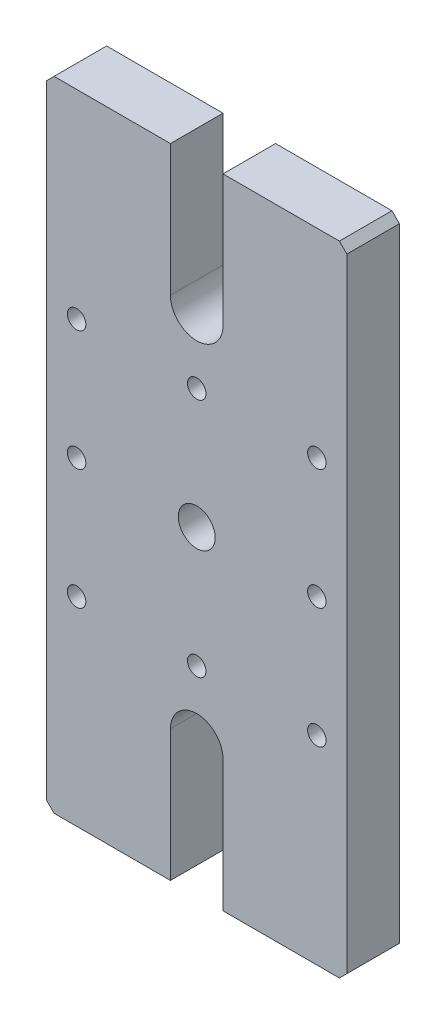
ISO-10303-21;
HEADER;
FILE_DESCRIPTION(('STEP AP214'),'2;1');
FILE_NAME('part.step','',(''),(''),'','','');
FILE_SCHEMA(('AUTOMOTIVE_DESIGN { 1 0 10303 214 1 1 1 1 }'));
ENDSEC;
DATA;
#1=APPLICATION_CONTEXT('core data for automotive mechanical design processes');
#2=APPLICATION_PROTOCOL_DEFINITION('international standard','automotive_design',2000,#1);
#3=PRODUCT_CONTEXT('',#1,'mechanical');
#4=PRODUCT('Part','Part','',(#3));
#5=PRODUCT_RELATED_PRODUCT_CATEGORY('part','',(#4));
#6=PRODUCT_DEFINITION_FORMATION('','',#4);
#7=PRODUCT_DEFINITION_CONTEXT('part definition',#1,'design');
#8=PRODUCT_DEFINITION('design','',#6,#7);
#9=PRODUCT_DEFINITION_SHAPE('','',#8);
#10=(LENGTH_UNIT() NAMED_UNIT(*) SI_UNIT(.MILLI.,.METRE.));
#11=(NAMED_UNIT(*) PLANE_ANGLE_UNIT() SI_UNIT($,.RADIAN.));
#12=(NAMED_UNIT(*) SI_UNIT($,.STERADIAN.) SOLID_ANGLE_UNIT());
#13=UNCERTAINTY_MEASURE_WITH_UNIT(LENGTH_MEASURE(1.E-05),#10,'distance_accuracy_value','');
#14=(GEOMETRIC_REPRESENTATION_CONTEXT(3) GLOBAL_UNCERTAINTY_ASSIGNED_CONTEXT((#13)) GLOBAL_UNIT_ASSIGNED_CONTEXT((#10,
#11,#12)) REPRESENTATION_CONTEXT('',''));
#15=CARTESIAN_POINT('',(0.,0.,0.));
#16=DIRECTION('',(0.,0.,1.));
#17=DIRECTION('',(1.,0.,0.));
#18=AXIS2_PLACEMENT_3D('',#15,#16,#17);
#19=CARTESIAN_POINT('',(-20.,42.5,0.));
#20=DIRECTION('',(0.,1.,0.));
#21=DIRECTION('',(1.,0.,0.));
#22=AXIS2_PLACEMENT_3D('',#19,#20,#21);
#23=PLANE('',#22);
#24=DIRECTION('',(0.,0.,1.));
#25=VECTOR('',#24,1.);
#26=CARTESIAN_POINT('',(19.,42.5,0.));
#27=LINE('',#26,#25);
#28=CARTESIAN_POINT('',(19.,42.5,0.));
#29=VERTEX_POINT('',#28);
#30=CARTESIAN_POINT('',(19.,42.5,7.));
#31=VERTEX_POINT('',#30);
#32=EDGE_CURVE('E351',#29,#31,#27,.T.);
#33=ORIENTED_EDGE('',*,*,#32,.F.);
#34=DIRECTION('',(1.,0.,0.));
#35=VECTOR('',#34,1.);
#36=CARTESIAN_POINT('',(3.5,42.5,0.));
#37=LINE('',#36,#35);
#38=CARTESIAN_POINT('',(3.5,42.5,0.));
#39=VERTEX_POINT('',#38);
#40=EDGE_CURVE('E297',#39,#29,#37,.T.);
#41=ORIENTED_EDGE('',*,*,#40,.F.);
#42=DIRECTION('',(0.,0.,1.));
#43=VECTOR('',#42,1.);
#44=CARTESIAN_POINT('',(3.5,42.5,0.));
#45=LINE('',#44,#43);
#46=CARTESIAN_POINT('',(3.5,42.5,7.));
#47=VERTEX_POINT('',#46);
#48=EDGE_CURVE('E210',#39,#47,#45,.T.);
#49=ORIENTED_EDGE('',*,*,#48,.T.);
#50=DIRECTION('',(1.,0.,0.));
#51=VECTOR('',#50,1.);
#52=CARTESIAN_POINT('',(3.5,42.5,7.));
#53=LINE('',#52,#51);
#54=EDGE_CURVE('E10',#47,#31,#53,.T.);
#55=ORIENTED_EDGE('',*,*,#54,.T.);
#56=EDGE_LOOP('',(#33,#41,#49,#55));
#57=FACE_BOUND('',#56,.T.);
#58=ADVANCED_FACE('F15',(#57),#23,.T.);
#59=CARTESIAN_POINT('',(0.,0.,7.));
#60=DIRECTION('',(0.,0.,1.));
#61=DIRECTION('',(1.,0.,0.));
#62=AXIS2_PLACEMENT_3D('',#59,#60,#61);
#63=PLANE('',#62);
#64=CARTESIAN_POINT('',(0.,0.,7.));
#65=DIRECTION('',(0.,0.,-1.));
#66=DIRECTION('',(1.,0.,0.));
#67=AXIS2_PLACEMENT_3D('',#64,#65,#66);
#68=CIRCLE('',#67,2.4585);
#69=CARTESIAN_POINT('',(2.4585,0.,7.));
#70=VERTEX_POINT('',#69);
#71=EDGE_CURVE('E258',#70,#70,#68,.T.);
#72=ORIENTED_EDGE('',*,*,#71,.T.);
#73=EDGE_LOOP('',(#72));
#74=FACE_BOUND('',#73,.T.);
#75=CARTESIAN_POINT('',(16.,16.,7.));
#76=DIRECTION('',(0.,0.,-1.));
#77=DIRECTION('',(1.,0.,0.));
#78=AXIS2_PLACEMENT_3D('',#75,#76,#77);
#79=CIRCLE('',#78,1.2295);
#80=CARTESIAN_POINT('',(17.2295,16.,7.));
#81=VERTEX_POINT('',#80);
#82=EDGE_CURVE('E255',#81,#81,#79,.T.);
#83=ORIENTED_EDGE('',*,*,#82,.T.);
#84=EDGE_LOOP('',(#83));
#85=FACE_BOUND('',#84,.T.);
#86=CARTESIAN_POINT('',(0.,16.,7.));
#87=DIRECTION('',(0.,0.,-1.));
#88=DIRECTION('',(1.,0.,0.));
#89=AXIS2_PLACEMENT_3D('',#86,#87,#88);
#90=CIRCLE('',#89,1.2295);
#91=CARTESIAN_POINT('',(1.2295,16.,7.));
#92=VERTEX_POINT('',#91);
#93=EDGE_CURVE('E251',#92,#92,#90,.T.);
#94=ORIENTED_EDGE('',*,*,#93,.T.);
#95=EDGE_LOOP('',(#94));
#96=FACE_BOUND('',#95,.T.);
#97=CARTESIAN_POINT('',(-16.,16.,7.));
#98=DIRECTION('',(0.,0.,-1.));
#99=DIRECTION('',(1.,0.,0.));
#100=AXIS2_PLACEMENT_3D('',#97,#98,#99);
#101=CIRCLE('',#100,1.2295);
#102=CARTESIAN_POINT('',(-14.7705,16.,7.));
#103=VERTEX_POINT('',#102);
#104=EDGE_CURVE('E243',#103,#103,#101,.T.);
#105=ORIENTED_EDGE('',*,*,#104,.T.);
#106=EDGE_LOOP('',(#105));
#107=FACE_BOUND('',#106,.T.);
#108=CARTESIAN_POINT('',(16.,0.,7.));
#109=DIRECTION('',(0.,0.,-1.));
#110=DIRECTION('',(1.,0.,0.));
#111=AXIS2_PLACEMENT_3D('',#108,#109,#110);
#112=CIRCLE('',#111,1.2295);
#113=CARTESIAN_POINT('',(17.2295,0.,7.));
#114=VERTEX_POINT('',#113);
#115=EDGE_CURVE('E315',#114,#114,#112,.T.);
#116=ORIENTED_EDGE('',*,*,#115,.T.);
#117=EDGE_LOOP('',(#116));
#118=FACE_BOUND('',#117,.T.);
#119=CARTESIAN_POINT('',(-16.,0.,7.));
#120=DIRECTION('',(0.,0.,-1.));
#121=DIRECTION('',(1.,0.,0.));
#122=AXIS2_PLACEMENT_3D('',#119,#120,#121);
#123=CIRCLE('',#122,1.2295);
#124=CARTESIAN_POINT('',(-14.7705,0.,7.));
#125=VERTEX_POINT('',#124);
#126=EDGE_CURVE('E313',#125,#125,#123,.T.);
#127=ORIENTED_EDGE('',*,*,#126,.T.);
#128=EDGE_LOOP('',(#127));
#129=FACE_BOUND('',#128,.T.);
#130=CARTESIAN_POINT('',(16.,-16.,7.));
#131=DIRECTION('',(0.,0.,-1.));
#132=DIRECTION('',(1.,0.,0.));
#133=AXIS2_PLACEMENT_3D('',#130,#131,#132);
#134=CIRCLE('',#133,1.2295);
#135=CARTESIAN_POINT('',(17.2295,-16.,7.));
#136=VERTEX_POINT('',#135);
#137=EDGE_CURVE('E316',#136,#136,#134,.T.);
#138=ORIENTED_EDGE('',*,*,#137,.T.);
#139=EDGE_LOOP('',(#138));
#140=FACE_BOUND('',#139,.T.);
#141=CARTESIAN_POINT('',(0.,-16.,7.));
#142=DIRECTION('',(0.,0.,-1.));
#143=DIRECTION('',(1.,0.,0.));
#144=AXIS2_PLACEMENT_3D('',#141,#142,#143);
#145=CIRCLE('',#144,1.2295);
#146=CARTESIAN_POINT('',(1.2295,-16.,7.));
#147=VERTEX_POINT('',#146);
#148=EDGE_CURVE('E376',#147,#147,#145,.T.);
#149=ORIENTED_EDGE('',*,*,#148,.T.);
#150=EDGE_LOOP('',(#149));
#151=FACE_BOUND('',#150,.T.);
#152=CARTESIAN_POINT('',(-16.,-16.,7.));
#153=DIRECTION('',(0.,0.,-1.));
#154=DIRECTION('',(1.,0.,0.));
#155=AXIS2_PLACEMENT_3D('',#152,#153,#154);
#156=CIRCLE('',#155,1.2295);
#157=CARTESIAN_POINT('',(-14.7705,-16.,7.));
#158=VERTEX_POINT('',#157);
#159=EDGE_CURVE('E419',#158,#158,#156,.T.);
#160=ORIENTED_EDGE('',*,*,#159,.T.);
#161=EDGE_LOOP('',(#160));
#162=FACE_BOUND('',#161,.T.);
#163=DIRECTION('',(-0.707106781186548,0.707106781186548,0.));
#164=VECTOR('',#163,1.);
#165=CARTESIAN_POINT('',(-19.,-42.5,7.));
#166=LINE('',#165,#164);
#167=CARTESIAN_POINT('',(-19.,-42.5,7.));
#168=VERTEX_POINT('',#167);
#169=CARTESIAN_POINT('',(-20.,-41.5,7.));
#170=VERTEX_POINT('',#169);
#171=EDGE_CURVE('E448',#168,#170,#166,.T.);
#172=ORIENTED_EDGE('',*,*,#171,.F.);
#173=DIRECTION('',(-1.,0.,0.));
#174=VECTOR('',#173,1.);
#175=CARTESIAN_POINT('',(-3.5,-42.5,7.));
#176=LINE('',#175,#174);
#177=CARTESIAN_POINT('',(-3.5,-42.5,7.));
#178=VERTEX_POINT('',#177);
#179=EDGE_CURVE('E23',#178,#168,#176,.T.);
#180=ORIENTED_EDGE('',*,*,#179,.F.);
#181=DIRECTION('',(0.,1.,0.));
#182=VECTOR('',#181,1.);
#183=CARTESIAN_POINT('',(-3.5,-42.5,7.));
#184=LINE('',#183,#182);
#185=CARTESIAN_POINT('',(-3.5,-25.,7.));
#186=VERTEX_POINT('',#185);
#187=EDGE_CURVE('E196',#178,#186,#184,.T.);
#188=ORIENTED_EDGE('',*,*,#187,.T.);
#189=CARTESIAN_POINT('',(0.,-25.,7.));
#190=DIRECTION('',(0.,0.,-1.));
#191=DIRECTION('',(0.999999999999981,1.93201454E-07,0.));
#192=AXIS2_PLACEMENT_3D('',#189,#190,#191);
#193=CIRCLE('',#192,3.5);
#194=CARTESIAN_POINT('',(3.5,-24.9999993237949,7.));
#195=VERTEX_POINT('',#194);
#196=EDGE_CURVE('E183',#186,#195,#193,.T.);
#197=ORIENTED_EDGE('',*,*,#196,.T.);
#198=DIRECTION('',(0.,-1.,0.));
#199=VECTOR('',#198,1.);
#200=CARTESIAN_POINT('',(3.5,-24.9999993237949,7.));
#201=LINE('',#200,#199);
#202=CARTESIAN_POINT('',(3.5,-42.5,7.));
#203=VERTEX_POINT('',#202);
#204=EDGE_CURVE('E47',#195,#203,#201,.T.);
#205=ORIENTED_EDGE('',*,*,#204,.T.);
#206=DIRECTION('',(-1.,0.,0.));
#207=VECTOR('',#206,1.);
#208=CARTESIAN_POINT('',(19.,-42.5,7.));
#209=LINE('',#208,#207);
#210=CARTESIAN_POINT('',(19.,-42.5,7.));
#211=VERTEX_POINT('',#210);
#212=EDGE_CURVE('E35',#211,#203,#209,.T.);
#213=ORIENTED_EDGE('',*,*,#212,.F.);
#214=DIRECTION('',(-0.707106781186548,-0.707106781186548,0.));
#215=VECTOR('',#214,1.);
#216=CARTESIAN_POINT('',(20.,-41.5,7.));
#217=LINE('',#216,#215);
#218=CARTESIAN_POINT('',(20.,-41.5,7.));
#219=VERTEX_POINT('',#218);
#220=EDGE_CURVE('E341',#219,#211,#217,.T.);
#221=ORIENTED_EDGE('',*,*,#220,.F.);
#222=DIRECTION('',(0.,-1.,0.));
#223=VECTOR('',#222,1.);
#224=CARTESIAN_POINT('',(20.,41.5,7.));
#225=LINE('',#224,#223);
#226=CARTESIAN_POINT('',(20.,41.5,7.));
#227=VERTEX_POINT('',#226);
#228=EDGE_CURVE('E409',#227,#219,#225,.T.);
#229=ORIENTED_EDGE('',*,*,#228,.F.);
#230=DIRECTION('',(0.707106781186548,-0.707106781186548,0.));
#231=VECTOR('',#230,1.);
#232=CARTESIAN_POINT('',(19.,42.5,7.));
#233=LINE('',#232,#231);
#234=EDGE_CURVE('E352',#31,#227,#233,.T.);
#235=ORIENTED_EDGE('',*,*,#234,.F.);
#236=ORIENTED_EDGE('',*,*,#54,.F.);
#237=DIRECTION('',(0.,-1.,0.));
#238=VECTOR('',#237,1.);
#239=CARTESIAN_POINT('',(3.5,42.5,7.));
#240=LINE('',#239,#238);
#241=CARTESIAN_POINT('',(3.5,25.,7.));
#242=VERTEX_POINT('',#241);
#243=EDGE_CURVE('E217',#47,#242,#240,.T.);
#244=ORIENTED_EDGE('',*,*,#243,.T.);
#245=CARTESIAN_POINT('',(0.,25.,7.));
#246=DIRECTION('',(0.,0.,-1.));
#247=DIRECTION('',(-1.,0.,0.));
#248=AXIS2_PLACEMENT_3D('',#245,#246,#247);
#249=CIRCLE('',#248,3.5);
#250=CARTESIAN_POINT('',(-3.5,25.,7.));
#251=VERTEX_POINT('',#250);
#252=EDGE_CURVE('E270',#242,#251,#249,.T.);
#253=ORIENTED_EDGE('',*,*,#252,.T.);
#254=DIRECTION('',(0.,1.,0.));
#255=VECTOR('',#254,1.);
#256=CARTESIAN_POINT('',(-3.5,25.,7.));
#257=LINE('',#256,#255);
#258=CARTESIAN_POINT('',(-3.5,42.5,7.));
#259=VERTEX_POINT('',#258);
#260=EDGE_CURVE('E245',#251,#259,#257,.T.);
#261=ORIENTED_EDGE('',*,*,#260,.T.);
#262=DIRECTION('',(1.,0.,0.));
#263=VECTOR('',#262,1.);
#264=CARTESIAN_POINT('',(-19.,42.5,7.));
#265=LINE('',#264,#263);
#266=CARTESIAN_POINT('',(-19.,42.5,7.));
#267=VERTEX_POINT('',#266);
#268=EDGE_CURVE('E227',#267,#259,#265,.T.);
#269=ORIENTED_EDGE('',*,*,#268,.F.);
#270=DIRECTION('',(0.707106781186548,0.707106781186548,0.));
#271=VECTOR('',#270,1.);
#272=CARTESIAN_POINT('',(-20.,41.5,7.));
#273=LINE('',#272,#271);
#274=CARTESIAN_POINT('',(-20.,41.5,7.));
#275=VERTEX_POINT('',#274);
#276=EDGE_CURVE('E369',#275,#267,#273,.T.);
#277=ORIENTED_EDGE('',*,*,#276,.F.);
#278=DIRECTION('',(0.,1.,0.));
#279=VECTOR('',#278,1.);
#280=CARTESIAN_POINT('',(-20.,-41.5,7.));
#281=LINE('',#280,#279);
#282=EDGE_CURVE('E321',#170,#275,#281,.T.);
#283=ORIENTED_EDGE('',*,*,#282,.F.);
#284=EDGE_LOOP('',(#172,#180,#188,#197,#205,#213,#221,#229,#235,#236,#244,#253,#261,#269,#277,#283));
#285=FACE_BOUND('',#284,.T.);
#286=ADVANCED_FACE('F198',(#74,#85,#96,#107,#118,#129,#140,#151,#162,#285),#63,.T.);
#287=CARTESIAN_POINT('',(20.,-42.5,0.));
#288=DIRECTION('',(0.,-1.,0.));
#289=DIRECTION('',(0.,0.,-1.));
#290=AXIS2_PLACEMENT_3D('',#287,#288,#289);
#291=PLANE('',#290);
#292=DIRECTION('',(0.,0.,1.));
#293=VECTOR('',#292,1.);
#294=CARTESIAN_POINT('',(-19.,-42.5,0.));
#295=LINE('',#294,#293);
#296=CARTESIAN_POINT('',(-19.,-42.5,0.));
#297=VERTEX_POINT('',#296);
#298=EDGE_CURVE('E458',#297,#168,#295,.T.);
#299=ORIENTED_EDGE('',*,*,#298,.F.);
#300=DIRECTION('',(-1.,0.,0.));
#301=VECTOR('',#300,1.);
#302=CARTESIAN_POINT('',(-3.5,-42.5,0.));
#303=LINE('',#302,#301);
#304=CARTESIAN_POINT('',(-3.5,-42.5,0.));
#305=VERTEX_POINT('',#304);
#306=EDGE_CURVE('E360',#305,#297,#303,.T.);
#307=ORIENTED_EDGE('',*,*,#306,.F.);
#308=DIRECTION('',(0.,0.,1.));
#309=VECTOR('',#308,1.);
#310=CARTESIAN_POINT('',(-3.5,-42.5,0.));
#311=LINE('',#310,#309);
#312=EDGE_CURVE('E203',#305,#178,#311,.T.);
#313=ORIENTED_EDGE('',*,*,#312,.T.);
#314=ORIENTED_EDGE('',*,*,#179,.T.);
#315=EDGE_LOOP('',(#299,#307,#313,#314));
#316=FACE_BOUND('',#315,.T.);
#317=ADVANCED_FACE('F546',(#316),#291,.T.);
#318=CARTESIAN_POINT('',(20.,-42.5,0.));
#319=DIRECTION('',(0.,-1.,0.));
#320=DIRECTION('',(0.,0.,-1.));
#321=AXIS2_PLACEMENT_3D('',#318,#319,#320);
#322=PLANE('',#321);
#323=DIRECTION('',(0.,0.,-1.));
#324=VECTOR('',#323,1.);
#325=CARTESIAN_POINT('',(19.,-42.5,7.));
#326=LINE('',#325,#324);
#327=CARTESIAN_POINT('',(19.,-42.5,0.));
#328=VERTEX_POINT('',#327);
#329=EDGE_CURVE('E345',#211,#328,#326,.T.);
#330=ORIENTED_EDGE('',*,*,#329,.F.);
#331=ORIENTED_EDGE('',*,*,#212,.T.);
#332=DIRECTION('',(0.,0.,-1.));
#333=VECTOR('',#332,1.);
#334=CARTESIAN_POINT('',(3.5,-42.5,7.));
#335=LINE('',#334,#333);
#336=CARTESIAN_POINT('',(3.5,-42.5,0.));
#337=VERTEX_POINT('',#336);
#338=EDGE_CURVE('E193',#203,#337,#335,.T.);
#339=ORIENTED_EDGE('',*,*,#338,.T.);
#340=DIRECTION('',(-1.,0.,0.));
#341=VECTOR('',#340,1.);
#342=CARTESIAN_POINT('',(19.,-42.5,0.));
#343=LINE('',#342,#341);
#344=EDGE_CURVE('E328',#328,#337,#343,.T.);
#345=ORIENTED_EDGE('',*,*,#344,.F.);
#346=EDGE_LOOP('',(#330,#331,#339,#345));
#347=FACE_BOUND('',#346,.T.);
#348=ADVANCED_FACE('F578',(#347),#322,.T.);
#349=CARTESIAN_POINT('',(-20.,42.5,0.));
#350=DIRECTION('',(0.,1.,0.));
#351=DIRECTION('',(1.,0.,0.));
#352=AXIS2_PLACEMENT_3D('',#349,#350,#351);
#353=PLANE('',#352);
#354=DIRECTION('',(0.,0.,-1.));
#355=VECTOR('',#354,1.);
#356=CARTESIAN_POINT('',(-19.,42.5,7.));
#357=LINE('',#356,#355);
#358=CARTESIAN_POINT('',(-19.,42.5,0.));
#359=VERTEX_POINT('',#358);
#360=EDGE_CURVE('E377',#267,#359,#357,.T.);
#361=ORIENTED_EDGE('',*,*,#360,.F.);
#362=ORIENTED_EDGE('',*,*,#268,.T.);
#363=DIRECTION('',(0.,0.,-1.));
#364=VECTOR('',#363,1.);
#365=CARTESIAN_POINT('',(-3.5,42.5,7.));
#366=LINE('',#365,#364);
#367=CARTESIAN_POINT('',(-3.5,42.5,0.));
#368=VERTEX_POINT('',#367);
#369=EDGE_CURVE('E250',#259,#368,#366,.T.);
#370=ORIENTED_EDGE('',*,*,#369,.T.);
#371=DIRECTION('',(1.,0.,0.));
#372=VECTOR('',#371,1.);
#373=CARTESIAN_POINT('',(-19.,42.5,0.));
#374=LINE('',#373,#372);
#375=EDGE_CURVE('E309',#359,#368,#374,.T.);
#376=ORIENTED_EDGE('',*,*,#375,.F.);
#377=EDGE_LOOP('',(#361,#362,#370,#376));
#378=FACE_BOUND('',#377,.T.);
#379=ADVANCED_FACE('F479',(#378),#353,.T.);
#380=CARTESIAN_POINT('',(3.5,-42.5,7.));
#381=DIRECTION('',(1.,0.,0.));
#382=DIRECTION('',(0.,1.,0.));
#383=AXIS2_PLACEMENT_3D('',#380,#381,#382);
#384=PLANE('',#383);
#385=DIRECTION('',(0.,1.,0.));
#386=VECTOR('',#385,1.);
#387=CARTESIAN_POINT('',(3.5,-42.5,0.));
#388=LINE('',#387,#386);
#389=CARTESIAN_POINT('',(3.5,-24.9999993237949,0.));
#390=VERTEX_POINT('',#389);
#391=EDGE_CURVE('E323',#337,#390,#388,.T.);
#392=ORIENTED_EDGE('',*,*,#391,.F.);
#393=ORIENTED_EDGE('',*,*,#338,.F.);
#394=ORIENTED_EDGE('',*,*,#204,.F.);
#395=DIRECTION('',(0.,0.,-1.));
#396=VECTOR('',#395,1.);
#397=CARTESIAN_POINT('',(3.5,-24.9999993237949,7.));
#398=LINE('',#397,#396);
#399=EDGE_CURVE('E190',#195,#390,#398,.T.);
#400=ORIENTED_EDGE('',*,*,#399,.T.);
#401=EDGE_LOOP('',(#392,#393,#394,#400));
#402=FACE_BOUND('',#401,.T.);
#403=ADVANCED_FACE('F576',(#402),#384,.F.);
#404=CARTESIAN_POINT('',(0.,-25.,7.));
#405=DIRECTION('',(0.,0.,-1.));
#406=DIRECTION('',(0.999999999999981,1.93201454E-07,0.));
#407=AXIS2_PLACEMENT_3D('',#404,#405,#406);
#408=CYLINDRICAL_SURFACE('',#407,3.5);
#409=CARTESIAN_POINT('',(0.,-25.,0.));
#410=DIRECTION('',(0.,0.,1.));
#411=DIRECTION('',(0.999999999999981,1.93201454E-07,0.));
#412=AXIS2_PLACEMENT_3D('',#409,#410,#411);
#413=CIRCLE('',#412,3.5);
#414=CARTESIAN_POINT('',(-3.5,-25.,0.));
#415=VERTEX_POINT('',#414);
#416=EDGE_CURVE('E327',#390,#415,#413,.T.);
#417=ORIENTED_EDGE('',*,*,#416,.F.);
#418=ORIENTED_EDGE('',*,*,#399,.F.);
#419=ORIENTED_EDGE('',*,*,#196,.F.);
#420=DIRECTION('',(0.,0.,-1.));
#421=VECTOR('',#420,1.);
#422=CARTESIAN_POINT('',(-3.5,-25.,7.));
#423=LINE('',#422,#421);
#424=EDGE_CURVE('E188',#186,#415,#423,.T.);
#425=ORIENTED_EDGE('',*,*,#424,.T.);
#426=EDGE_LOOP('',(#417,#418,#419,#425));
#427=FACE_BOUND('',#426,.T.);
#428=ADVANCED_FACE('F186',(#427),#408,.F.);
#429=CARTESIAN_POINT('',(-3.5,-25.,7.));
#430=DIRECTION('',(-1.,0.,0.));
#431=DIRECTION('',(0.,0.,1.));
#432=AXIS2_PLACEMENT_3D('',#429,#430,#431);
#433=PLANE('',#432);
#434=DIRECTION('',(0.,-1.,0.));
#435=VECTOR('',#434,1.);
#436=CARTESIAN_POINT('',(-3.5,-25.,0.));
#437=LINE('',#436,#435);
#438=EDGE_CURVE('E207',#415,#305,#437,.T.);
#439=ORIENTED_EDGE('',*,*,#438,.F.);
#440=ORIENTED_EDGE('',*,*,#424,.F.);
#441=ORIENTED_EDGE('',*,*,#187,.F.);
#442=ORIENTED_EDGE('',*,*,#312,.F.);
#443=EDGE_LOOP('',(#439,#440,#441,#442));
#444=FACE_BOUND('',#443,.T.);
#445=ADVANCED_FACE('F205',(#444),#433,.F.);
#446=CARTESIAN_POINT('',(3.5,25.,7.));
#447=DIRECTION('',(1.,0.,0.));
#448=DIRECTION('',(0.,1.,0.));
#449=AXIS2_PLACEMENT_3D('',#446,#447,#448);
#450=PLANE('',#449);
#451=DIRECTION('',(0.,1.,0.));
#452=VECTOR('',#451,1.);
#453=CARTESIAN_POINT('',(3.5,25.,0.));
#454=LINE('',#453,#452);
#455=CARTESIAN_POINT('',(3.5,25.,0.));
#456=VERTEX_POINT('',#455);
#457=EDGE_CURVE('E291',#456,#39,#454,.T.);
#458=ORIENTED_EDGE('',*,*,#457,.F.);
#459=DIRECTION('',(0.,0.,-1.));
#460=VECTOR('',#459,1.);
#461=CARTESIAN_POINT('',(3.5,25.,7.));
#462=LINE('',#461,#460);
#463=EDGE_CURVE('E264',#242,#456,#462,.T.);
#464=ORIENTED_EDGE('',*,*,#463,.F.);
#465=ORIENTED_EDGE('',*,*,#243,.F.);
#466=ORIENTED_EDGE('',*,*,#48,.F.);
#467=EDGE_LOOP('',(#458,#464,#465,#466));
#468=FACE_BOUND('',#467,.T.);
#469=ADVANCED_FACE('F292',(#468),#450,.F.);
#470=CARTESIAN_POINT('',(0.,25.,7.));
#471=DIRECTION('',(0.,0.,-1.));
#472=DIRECTION('',(-1.,0.,0.));
#473=AXIS2_PLACEMENT_3D('',#470,#471,#472);
#474=CYLINDRICAL_SURFACE('',#473,3.5);
#475=CARTESIAN_POINT('',(0.,25.,0.));
#476=DIRECTION('',(0.,0.,1.));
#477=DIRECTION('',(-1.,0.,0.));
#478=AXIS2_PLACEMENT_3D('',#475,#476,#477);
#479=CIRCLE('',#478,3.5);
#480=CARTESIAN_POINT('',(-3.5,25.,0.));
#481=VERTEX_POINT('',#480);
#482=EDGE_CURVE('E284',#481,#456,#479,.T.);
#483=ORIENTED_EDGE('',*,*,#482,.F.);
#484=DIRECTION('',(0.,0.,-1.));
#485=VECTOR('',#484,1.);
#486=CARTESIAN_POINT('',(-3.5,25.,7.));
#487=LINE('',#486,#485);
#488=EDGE_CURVE('E249',#251,#481,#487,.T.);
#489=ORIENTED_EDGE('',*,*,#488,.F.);
#490=ORIENTED_EDGE('',*,*,#252,.F.);
#491=ORIENTED_EDGE('',*,*,#463,.T.);
#492=EDGE_LOOP('',(#483,#489,#490,#491));
#493=FACE_BOUND('',#492,.T.);
#494=ADVANCED_FACE('F281',(#493),#474,.F.);
#495=CARTESIAN_POINT('',(-3.5,42.5,7.));
#496=DIRECTION('',(-1.,0.,0.));
#497=DIRECTION('',(0.,0.,1.));
#498=AXIS2_PLACEMENT_3D('',#495,#496,#497);
#499=PLANE('',#498);
#500=DIRECTION('',(0.,-1.,0.));
#501=VECTOR('',#500,1.);
#502=CARTESIAN_POINT('',(-3.5,42.5,0.));
#503=LINE('',#502,#501);
#504=EDGE_CURVE('E303',#368,#481,#503,.T.);
#505=ORIENTED_EDGE('',*,*,#504,.F.);
#506=ORIENTED_EDGE('',*,*,#369,.F.);
#507=ORIENTED_EDGE('',*,*,#260,.F.);
#508=ORIENTED_EDGE('',*,*,#488,.T.);
#509=EDGE_LOOP('',(#505,#506,#507,#508));
#510=FACE_BOUND('',#509,.T.);
#511=ADVANCED_FACE('F604',(#510),#499,.F.);
#512=CARTESIAN_POINT('',(-2.4585,0.,7.));
#513=CARTESIAN_POINT('',(-2.4585,-2.4585,7.00000000000001));
#514=CARTESIAN_POINT('',(0.,-2.4585,7.));
#515=CARTESIAN_POINT('',(2.4585,-2.4585,7.00000000000001));
#516=CARTESIAN_POINT('',(2.4585,0.,7.));
#517=CARTESIAN_POINT('',(2.4585,2.4585,7.00000000000001));
#518=CARTESIAN_POINT('',(0.,2.4585,7.));
#519=CARTESIAN_POINT('',(-2.4585,2.4585,7.00000000000001));
#520=CARTESIAN_POINT('',(-2.4585,0.,7.));
#521=CARTESIAN_POINT('',(-2.4585,0.,0.));
#522=CARTESIAN_POINT('',(-2.4585,-2.4585,0.));
#523=CARTESIAN_POINT('',(0.,-2.4585,0.));
#524=CARTESIAN_POINT('',(2.4585,-2.4585,0.));
#525=CARTESIAN_POINT('',(2.4585,0.,0.));
#526=CARTESIAN_POINT('',(2.4585,2.4585,0.));
#527=CARTESIAN_POINT('',(0.,2.4585,0.));
#528=CARTESIAN_POINT('',(-2.4585,2.4585,0.));
#529=CARTESIAN_POINT('',(-2.4585,0.,0.));
#530=(BOUNDED_SURFACE() B_SPLINE_SURFACE(1,2,((#512,#513,#514,#515,#516,#517,#518,#519,#520),
(#521,#522,#523,#524,#525,#526,#527,#528,#529)),.UNSPECIFIED.,.F.,.T.,
.F.) B_SPLINE_SURFACE_WITH_KNOTS((2,2),(3,2,2,2,3),(-38.3168235951375,-35.4695590029064),(0.,
3.86180276942525,7.72360553885051,11.5854083082758,15.447211077701),
.UNSPECIFIED.) GEOMETRIC_REPRESENTATION_ITEM() RATIONAL_B_SPLINE_SURFACE(((1.,0.707106781186548,
1.,0.707106781186548,1.,0.707106781186548,1.,0.707106781186548,1.),(1.,0.707106781186548,1.,
0.707106781186548,1.,0.707106781186548,1.,0.707106781186548,1.))) REPRESENTATION_ITEM('') SURFACE());
#531=CARTESIAN_POINT('',(0.,0.,0.));
#532=DIRECTION('',(0.,0.,1.));
#533=DIRECTION('',(1.,0.,0.));
#534=AXIS2_PLACEMENT_3D('',#531,#532,#533);
#535=CIRCLE('',#534,2.4585);
#536=CARTESIAN_POINT('',(-2.4585,0.,0.));
#537=VERTEX_POINT('',#536);
#538=EDGE_CURVE('E318',#537,#537,#535,.T.);
#539=ORIENTED_EDGE('',*,*,#71,.F.);
#540=EDGE_LOOP('',(#539));
#541=FACE_BOUND('',#540,.T.);
#542=ORIENTED_EDGE('',*,*,#538,.F.);
#543=EDGE_LOOP('',(#542));
#544=FACE_BOUND('',#543,.T.);
#545=ADVANCED_FACE('F594',(#541,#544),#530,.F.);
#546=CARTESIAN_POINT('',(14.7705,16.,7.));
#547=CARTESIAN_POINT('',(14.7705,14.7705,7.00000000000002));
#548=CARTESIAN_POINT('',(16.,14.7705,7.));
#549=CARTESIAN_POINT('',(17.2295,14.7705,7.00000000000002));
#550=CARTESIAN_POINT('',(17.2295,16.,7.));
#551=CARTESIAN_POINT('',(17.2295,17.2295,7.00000000000002));
#552=CARTESIAN_POINT('',(16.,17.2295,7.));
#553=CARTESIAN_POINT('',(14.7705,17.2295,7.00000000000002));
#554=CARTESIAN_POINT('',(14.7705,16.,7.));
#555=CARTESIAN_POINT('',(14.7705,16.,0.));
#556=CARTESIAN_POINT('',(14.7705,14.7705,0.));
#557=CARTESIAN_POINT('',(16.,14.7705,0.));
#558=CARTESIAN_POINT('',(17.2295,14.7705,0.));
#559=CARTESIAN_POINT('',(17.2295,16.,0.));
#560=CARTESIAN_POINT('',(17.2295,17.2295,0.));
#561=CARTESIAN_POINT('',(16.,17.2295,0.));
#562=CARTESIAN_POINT('',(14.7705,17.2295,0.));
#563=CARTESIAN_POINT('',(14.7705,16.,0.));
#564=(BOUNDED_SURFACE() B_SPLINE_SURFACE(1,2,((#546,#547,#548,#549,#550,#551,#552,#553,#554),
(#555,#556,#557,#558,#559,#560,#561,#562,#563)),.UNSPECIFIED.,.F.,.T.,
.F.) B_SPLINE_SURFACE_WITH_KNOTS((2,2),(3,2,2,2,3),(-76.6180649114644,-70.9246936223225),(0.,
1.93129408379433,3.86258816758865,5.79388225138298,7.7251763351773),
.UNSPECIFIED.) GEOMETRIC_REPRESENTATION_ITEM() RATIONAL_B_SPLINE_SURFACE(((1.,0.707106781186548,
1.,0.707106781186548,1.,0.707106781186548,1.,0.707106781186548,1.),(1.,0.707106781186548,1.,
0.707106781186548,1.,0.707106781186548,1.,0.707106781186548,1.))) REPRESENTATION_ITEM('') SURFACE());
#565=CARTESIAN_POINT('',(16.,16.,0.));
#566=DIRECTION('',(0.,0.,1.));
#567=DIRECTION('',(1.,0.,0.));
#568=AXIS2_PLACEMENT_3D('',#565,#566,#567);
#569=CIRCLE('',#568,1.2295);
#570=CARTESIAN_POINT('',(14.7705,16.,0.));
#571=VERTEX_POINT('',#570);
#572=EDGE_CURVE('E322',#571,#571,#569,.T.);
#573=ORIENTED_EDGE('',*,*,#82,.F.);
#574=EDGE_LOOP('',(#573));
#575=FACE_BOUND('',#574,.T.);
#576=ORIENTED_EDGE('',*,*,#572,.F.);
#577=EDGE_LOOP('',(#576));
#578=FACE_BOUND('',#577,.T.);
#579=ADVANCED_FACE('F500',(#575,#578),#564,.F.);
#580=CARTESIAN_POINT('',(-1.2295,16.,7.));
#581=CARTESIAN_POINT('',(-1.2295,14.7705,7.00000000000002));
#582=CARTESIAN_POINT('',(0.,14.7705,7.));
#583=CARTESIAN_POINT('',(1.2295,14.7705,7.00000000000002));
#584=CARTESIAN_POINT('',(1.2295,16.,7.));
#585=CARTESIAN_POINT('',(1.2295,17.2295,7.00000000000002));
#586=CARTESIAN_POINT('',(0.,17.2295,7.));
#587=CARTESIAN_POINT('',(-1.2295,17.2295,7.00000000000002));
#588=CARTESIAN_POINT('',(-1.2295,16.,7.));
#589=CARTESIAN_POINT('',(-1.2295,16.,0.));
#590=CARTESIAN_POINT('',(-1.2295,14.7705,0.));
#591=CARTESIAN_POINT('',(0.,14.7705,0.));
#592=CARTESIAN_POINT('',(1.2295,14.7705,0.));
#593=CARTESIAN_POINT('',(1.2295,16.,0.));
#594=CARTESIAN_POINT('',(1.2295,17.2295,0.));
#595=CARTESIAN_POINT('',(0.,17.2295,0.));
#596=CARTESIAN_POINT('',(-1.2295,17.2295,0.));
#597=CARTESIAN_POINT('',(-1.2295,16.,0.));
#598=(BOUNDED_SURFACE() B_SPLINE_SURFACE(1,2,((#580,#581,#582,#583,#584,#585,#586,#587,#588),
(#589,#590,#591,#592,#593,#594,#595,#596,#597)),.UNSPECIFIED.,.F.,.T.,
.F.) B_SPLINE_SURFACE_WITH_KNOTS((2,2),(3,2,2,2,3),(-76.6180649114644,-70.9246936223225),(0.,
1.93129408379433,3.86258816758865,5.79388225138298,7.7251763351773),
.UNSPECIFIED.) GEOMETRIC_REPRESENTATION_ITEM() RATIONAL_B_SPLINE_SURFACE(((1.,0.707106781186548,
1.,0.707106781186548,1.,0.707106781186548,1.,0.707106781186548,1.),(1.,0.707106781186548,1.,
0.707106781186548,1.,0.707106781186548,1.,0.707106781186548,1.))) REPRESENTATION_ITEM('') SURFACE());
#599=CARTESIAN_POINT('',(0.,16.,0.));
#600=DIRECTION('',(0.,0.,1.));
#601=DIRECTION('',(1.,0.,0.));
#602=AXIS2_PLACEMENT_3D('',#599,#600,#601);
#603=CIRCLE('',#602,1.2295);
#604=CARTESIAN_POINT('',(-1.2295,16.,0.));
#605=VERTEX_POINT('',#604);
#606=EDGE_CURVE('E390',#605,#605,#603,.T.);
#607=ORIENTED_EDGE('',*,*,#93,.F.);
#608=EDGE_LOOP('',(#607));
#609=FACE_BOUND('',#608,.T.);
#610=ORIENTED_EDGE('',*,*,#606,.F.);
#611=EDGE_LOOP('',(#610));
#612=FACE_BOUND('',#611,.T.);
#613=ADVANCED_FACE('F438',(#609,#612),#598,.F.);
#614=CARTESIAN_POINT('',(-17.2295,16.,7.));
#615=CARTESIAN_POINT('',(-17.2295,14.7705,7.00000000000002));
#616=CARTESIAN_POINT('',(-16.,14.7705,7.));
#617=CARTESIAN_POINT('',(-14.7705,14.7705,7.00000000000002));
#618=CARTESIAN_POINT('',(-14.7705,16.,7.));
#619=CARTESIAN_POINT('',(-14.7705,17.2295,7.00000000000002));
#620=CARTESIAN_POINT('',(-16.,17.2295,7.));
#621=CARTESIAN_POINT('',(-17.2295,17.2295,7.00000000000002));
#622=CARTESIAN_POINT('',(-17.2295,16.,7.));
#623=CARTESIAN_POINT('',(-17.2295,16.,0.));
#624=CARTESIAN_POINT('',(-17.2295,14.7705,0.));
#625=CARTESIAN_POINT('',(-16.,14.7705,0.));
#626=CARTESIAN_POINT('',(-14.7705,14.7705,0.));
#627=CARTESIAN_POINT('',(-14.7705,16.,0.));
#628=CARTESIAN_POINT('',(-14.7705,17.2295,0.));
#629=CARTESIAN_POINT('',(-16.,17.2295,0.));
#630=CARTESIAN_POINT('',(-17.2295,17.2295,0.));
#631=CARTESIAN_POINT('',(-17.2295,16.,0.));
#632=(BOUNDED_SURFACE() B_SPLINE_SURFACE(1,2,((#614,#615,#616,#617,#618,#619,#620,#621,#622),
(#623,#624,#625,#626,#627,#628,#629,#630,#631)),.UNSPECIFIED.,.F.,.T.,
.F.) B_SPLINE_SURFACE_WITH_KNOTS((2,2),(3,2,2,2,3),(-76.6180649114644,-70.9246936223225),(0.,
1.93129408379433,3.86258816758865,5.79388225138298,7.7251763351773),
.UNSPECIFIED.) GEOMETRIC_REPRESENTATION_ITEM() RATIONAL_B_SPLINE_SURFACE(((1.,0.707106781186548,
1.,0.707106781186548,1.,0.707106781186548,1.,0.707106781186548,1.),(1.,0.707106781186548,1.,
0.707106781186548,1.,0.707106781186548,1.,0.707106781186548,1.))) REPRESENTATION_ITEM('') SURFACE());
#633=CARTESIAN_POINT('',(-16.,16.,0.));
#634=DIRECTION('',(0.,0.,1.));
#635=DIRECTION('',(1.,0.,0.));
#636=AXIS2_PLACEMENT_3D('',#633,#634,#635);
#637=CIRCLE('',#636,1.2295);
#638=CARTESIAN_POINT('',(-17.2295,16.,0.));
#639=VERTEX_POINT('',#638);
#640=EDGE_CURVE('E389',#639,#639,#637,.T.);
#641=ORIENTED_EDGE('',*,*,#104,.F.);
#642=EDGE_LOOP('',(#641));
#643=FACE_BOUND('',#642,.T.);
#644=ORIENTED_EDGE('',*,*,#640,.F.);
#645=EDGE_LOOP('',(#644));
#646=FACE_BOUND('',#645,.T.);
#647=ADVANCED_FACE('F434',(#643,#646),#632,.F.);
#648=CARTESIAN_POINT('',(14.7705,0.,7.));
#649=CARTESIAN_POINT('',(14.7705,-1.2295,7.00000000000002));
#650=CARTESIAN_POINT('',(16.,-1.2295,7.));
#651=CARTESIAN_POINT('',(17.2295,-1.2295,7.00000000000002));
#652=CARTESIAN_POINT('',(17.2295,0.,7.));
#653=CARTESIAN_POINT('',(17.2295,1.2295,7.00000000000002));
#654=CARTESIAN_POINT('',(16.,1.2295,7.));
#655=CARTESIAN_POINT('',(14.7705,1.2295,7.00000000000002));
#656=CARTESIAN_POINT('',(14.7705,0.,7.));
#657=CARTESIAN_POINT('',(14.7705,0.,0.));
#658=CARTESIAN_POINT('',(14.7705,-1.2295,0.));
#659=CARTESIAN_POINT('',(16.,-1.2295,0.));
#660=CARTESIAN_POINT('',(17.2295,-1.2295,0.));
#661=CARTESIAN_POINT('',(17.2295,0.,0.));
#662=CARTESIAN_POINT('',(17.2295,1.2295,0.));
#663=CARTESIAN_POINT('',(16.,1.2295,0.));
#664=CARTESIAN_POINT('',(14.7705,1.2295,0.));
#665=CARTESIAN_POINT('',(14.7705,0.,0.));
#666=(BOUNDED_SURFACE() B_SPLINE_SURFACE(1,2,((#648,#649,#650,#651,#652,#653,#654,#655,#656),
(#657,#658,#659,#660,#661,#662,#663,#664,#665)),.UNSPECIFIED.,.F.,.T.,
.F.) B_SPLINE_SURFACE_WITH_KNOTS((2,2),(3,2,2,2,3),(-76.6180649114644,-70.9246936223225),(0.,
1.93129408379433,3.86258816758865,5.79388225138298,7.7251763351773),
.UNSPECIFIED.) GEOMETRIC_REPRESENTATION_ITEM() RATIONAL_B_SPLINE_SURFACE(((1.,0.707106781186548,
1.,0.707106781186548,1.,0.707106781186548,1.,0.707106781186548,1.),(1.,0.707106781186548,1.,
0.707106781186548,1.,0.707106781186548,1.,0.707106781186548,1.))) REPRESENTATION_ITEM('') SURFACE());
#667=CARTESIAN_POINT('',(16.,0.,0.));
#668=DIRECTION('',(0.,0.,1.));
#669=DIRECTION('',(1.,0.,0.));
#670=AXIS2_PLACEMENT_3D('',#667,#668,#669);
#671=CIRCLE('',#670,1.2295);
#672=CARTESIAN_POINT('',(14.7705,0.,0.));
#673=VERTEX_POINT('',#672);
#674=EDGE_CURVE('E386',#673,#673,#671,.T.);
#675=ORIENTED_EDGE('',*,*,#115,.F.);
#676=EDGE_LOOP('',(#675));
#677=FACE_BOUND('',#676,.T.);
#678=ORIENTED_EDGE('',*,*,#674,.F.);
#679=EDGE_LOOP('',(#678));
#680=FACE_BOUND('',#679,.T.);
#681=ADVANCED_FACE('F437',(#677,#680),#666,.F.);
#682=CARTESIAN_POINT('',(-17.2295,0.,7.));
#683=CARTESIAN_POINT('',(-17.2295,-1.2295,7.00000000000002));
#684=CARTESIAN_POINT('',(-16.,-1.2295,7.));
#685=CARTESIAN_POINT('',(-14.7705,-1.2295,7.00000000000002));
#686=CARTESIAN_POINT('',(-14.7705,0.,7.));
#687=CARTESIAN_POINT('',(-14.7705,1.2295,7.00000000000002));
#688=CARTESIAN_POINT('',(-16.,1.2295,7.));
#689=CARTESIAN_POINT('',(-17.2295,1.2295,7.00000000000002));
#690=CARTESIAN_POINT('',(-17.2295,0.,7.));
#691=CARTESIAN_POINT('',(-17.2295,0.,0.));
#692=CARTESIAN_POINT('',(-17.2295,-1.2295,0.));
#693=CARTESIAN_POINT('',(-16.,-1.2295,0.));
#694=CARTESIAN_POINT('',(-14.7705,-1.2295,0.));
#695=CARTESIAN_POINT('',(-14.7705,0.,0.));
#696=CARTESIAN_POINT('',(-14.7705,1.2295,0.));
#697=CARTESIAN_POINT('',(-16.,1.2295,0.));
#698=CARTESIAN_POINT('',(-17.2295,1.2295,0.));
#699=CARTESIAN_POINT('',(-17.2295,0.,0.));
#700=(BOUNDED_SURFACE() B_SPLINE_SURFACE(1,2,((#682,#683,#684,#685,#686,#687,#688,#689,#690),
(#691,#692,#693,#694,#695,#696,#697,#698,#699)),.UNSPECIFIED.,.F.,.T.,
.F.) B_SPLINE_SURFACE_WITH_KNOTS((2,2),(3,2,2,2,3),(-76.6180649114644,-70.9246936223225),(0.,
1.93129408379433,3.86258816758865,5.79388225138298,7.7251763351773),
.UNSPECIFIED.) GEOMETRIC_REPRESENTATION_ITEM() RATIONAL_B_SPLINE_SURFACE(((1.,0.707106781186548,
1.,0.707106781186548,1.,0.707106781186548,1.,0.707106781186548,1.),(1.,0.707106781186548,1.,
0.707106781186548,1.,0.707106781186548,1.,0.707106781186548,1.))) REPRESENTATION_ITEM('') SURFACE());
#701=CARTESIAN_POINT('',(-16.,0.,0.));
#702=DIRECTION('',(0.,0.,1.));
#703=DIRECTION('',(1.,0.,0.));
#704=AXIS2_PLACEMENT_3D('',#701,#702,#703);
#705=CIRCLE('',#704,1.2295);
#706=CARTESIAN_POINT('',(-17.2295,0.,0.));
#707=VERTEX_POINT('',#706);
#708=EDGE_CURVE('E383',#707,#707,#705,.T.);
#709=ORIENTED_EDGE('',*,*,#126,.F.);
#710=EDGE_LOOP('',(#709));
#711=FACE_BOUND('',#710,.T.);
#712=ORIENTED_EDGE('',*,*,#708,.F.);
#713=EDGE_LOOP('',(#712));
#714=FACE_BOUND('',#713,.T.);
#715=ADVANCED_FACE('F879',(#711,#714),#700,.F.);
#716=CARTESIAN_POINT('',(14.7705,-16.,7.));
#717=CARTESIAN_POINT('',(14.7705,-17.2295,7.00000000000002));
#718=CARTESIAN_POINT('',(16.,-17.2295,7.));
#719=CARTESIAN_POINT('',(17.2295,-17.2295,7.00000000000002));
#720=CARTESIAN_POINT('',(17.2295,-16.,7.));
#721=CARTESIAN_POINT('',(17.2295,-14.7705,7.00000000000002));
#722=CARTESIAN_POINT('',(16.,-14.7705,7.));
#723=CARTESIAN_POINT('',(14.7705,-14.7705,7.00000000000002));
#724=CARTESIAN_POINT('',(14.7705,-16.,7.));
#725=CARTESIAN_POINT('',(14.7705,-16.,0.));
#726=CARTESIAN_POINT('',(14.7705,-17.2295,0.));
#727=CARTESIAN_POINT('',(16.,-17.2295,0.));
#728=CARTESIAN_POINT('',(17.2295,-17.2295,0.));
#729=CARTESIAN_POINT('',(17.2295,-16.,0.));
#730=CARTESIAN_POINT('',(17.2295,-14.7705,0.));
#731=CARTESIAN_POINT('',(16.,-14.7705,0.));
#732=CARTESIAN_POINT('',(14.7705,-14.7705,0.));
#733=CARTESIAN_POINT('',(14.7705,-16.,0.));
#734=(BOUNDED_SURFACE() B_SPLINE_SURFACE(1,2,((#716,#717,#718,#719,#720,#721,#722,#723,#724),
(#725,#726,#727,#728,#729,#730,#731,#732,#733)),.UNSPECIFIED.,.F.,.T.,
.F.) B_SPLINE_SURFACE_WITH_KNOTS((2,2),(3,2,2,2,3),(-76.6180649114644,-70.9246936223225),(0.,
1.93129408379433,3.86258816758865,5.79388225138298,7.7251763351773),
.UNSPECIFIED.) GEOMETRIC_REPRESENTATION_ITEM() RATIONAL_B_SPLINE_SURFACE(((1.,0.707106781186548,
1.,0.707106781186548,1.,0.707106781186548,1.,0.707106781186548,1.),(1.,0.707106781186548,1.,
0.707106781186548,1.,0.707106781186548,1.,0.707106781186548,1.))) REPRESENTATION_ITEM('') SURFACE());
#735=CARTESIAN_POINT('',(16.,-16.,0.));
#736=DIRECTION('',(0.,0.,1.));
#737=DIRECTION('',(1.,0.,0.));
#738=AXIS2_PLACEMENT_3D('',#735,#736,#737);
#739=CIRCLE('',#738,1.2295);
#740=CARTESIAN_POINT('',(14.7705,-16.,0.));
#741=VERTEX_POINT('',#740);
#742=EDGE_CURVE('E372',#741,#741,#739,.T.);
#743=ORIENTED_EDGE('',*,*,#137,.F.);
#744=EDGE_LOOP('',(#743));
#745=FACE_BOUND('',#744,.T.);
#746=ORIENTED_EDGE('',*,*,#742,.F.);
#747=EDGE_LOOP('',(#746));
#748=FACE_BOUND('',#747,.T.);
#749=ADVANCED_FACE('F534',(#745,#748),#734,.F.);
#750=CARTESIAN_POINT('',(-1.2295,-16.,7.));
#751=CARTESIAN_POINT('',(-1.2295,-17.2295,7.00000000000002));
#752=CARTESIAN_POINT('',(0.,-17.2295,7.));
#753=CARTESIAN_POINT('',(1.2295,-17.2295,7.00000000000002));
#754=CARTESIAN_POINT('',(1.2295,-16.,7.));
#755=CARTESIAN_POINT('',(1.2295,-14.7705,7.00000000000002));
#756=CARTESIAN_POINT('',(0.,-14.7705,7.));
#757=CARTESIAN_POINT('',(-1.2295,-14.7705,7.00000000000002));
#758=CARTESIAN_POINT('',(-1.2295,-16.,7.));
#759=CARTESIAN_POINT('',(-1.2295,-16.,0.));
#760=CARTESIAN_POINT('',(-1.2295,-17.2295,0.));
#761=CARTESIAN_POINT('',(0.,-17.2295,0.));
#762=CARTESIAN_POINT('',(1.2295,-17.2295,0.));
#763=CARTESIAN_POINT('',(1.2295,-16.,0.));
#764=CARTESIAN_POINT('',(1.2295,-14.7705,0.));
#765=CARTESIAN_POINT('',(0.,-14.7705,0.));
#766=CARTESIAN_POINT('',(-1.2295,-14.7705,0.));
#767=CARTESIAN_POINT('',(-1.2295,-16.,0.));
#768=(BOUNDED_SURFACE() B_SPLINE_SURFACE(1,2,((#750,#751,#752,#753,#754,#755,#756,#757,#758),
(#759,#760,#761,#762,#763,#764,#765,#766,#767)),.UNSPECIFIED.,.F.,.T.,
.F.) B_SPLINE_SURFACE_WITH_KNOTS((2,2),(3,2,2,2,3),(-76.6180649114644,-70.9246936223225),(0.,
1.93129408379433,3.86258816758865,5.79388225138298,7.7251763351773),
.UNSPECIFIED.) GEOMETRIC_REPRESENTATION_ITEM() RATIONAL_B_SPLINE_SURFACE(((1.,0.707106781186548,
1.,0.707106781186548,1.,0.707106781186548,1.,0.707106781186548,1.),(1.,0.707106781186548,1.,
0.707106781186548,1.,0.707106781186548,1.,0.707106781186548,1.))) REPRESENTATION_ITEM('') SURFACE());
#769=CARTESIAN_POINT('',(0.,-16.,0.));
#770=DIRECTION('',(0.,0.,1.));
#771=DIRECTION('',(1.,0.,0.));
#772=AXIS2_PLACEMENT_3D('',#769,#770,#771);
#773=CIRCLE('',#772,1.2295);
#774=CARTESIAN_POINT('',(-1.2295,-16.,0.));
#775=VERTEX_POINT('',#774);
#776=EDGE_CURVE('E364',#775,#775,#773,.T.);
#777=ORIENTED_EDGE('',*,*,#148,.F.);
#778=EDGE_LOOP('',(#777));
#779=FACE_BOUND('',#778,.T.);
#780=ORIENTED_EDGE('',*,*,#776,.F.);
#781=EDGE_LOOP('',(#780));
#782=FACE_BOUND('',#781,.T.);
#783=ADVANCED_FACE('F523',(#779,#782),#768,.F.);
#784=CARTESIAN_POINT('',(-17.2295,-16.,7.));
#785=CARTESIAN_POINT('',(-17.2295,-17.2295,7.00000000000002));
#786=CARTESIAN_POINT('',(-16.,-17.2295,7.));
#787=CARTESIAN_POINT('',(-14.7705,-17.2295,7.00000000000002));
#788=CARTESIAN_POINT('',(-14.7705,-16.,7.));
#789=CARTESIAN_POINT('',(-14.7705,-14.7705,7.00000000000002));
#790=CARTESIAN_POINT('',(-16.,-14.7705,7.));
#791=CARTESIAN_POINT('',(-17.2295,-14.7705,7.00000000000002));
#792=CARTESIAN_POINT('',(-17.2295,-16.,7.));
#793=CARTESIAN_POINT('',(-17.2295,-16.,0.));
#794=CARTESIAN_POINT('',(-17.2295,-17.2295,0.));
#795=CARTESIAN_POINT('',(-16.,-17.2295,0.));
#796=CARTESIAN_POINT('',(-14.7705,-17.2295,0.));
#797=CARTESIAN_POINT('',(-14.7705,-16.,0.));
#798=CARTESIAN_POINT('',(-14.7705,-14.7705,0.));
#799=CARTESIAN_POINT('',(-16.,-14.7705,0.));
#800=CARTESIAN_POINT('',(-17.2295,-14.7705,0.));
#801=CARTESIAN_POINT('',(-17.2295,-16.,0.));
#802=(BOUNDED_SURFACE() B_SPLINE_SURFACE(1,2,((#784,#785,#786,#787,#788,#789,#790,#791,#792),
(#793,#794,#795,#796,#797,#798,#799,#800,#801)),.UNSPECIFIED.,.F.,.T.,
.F.) B_SPLINE_SURFACE_WITH_KNOTS((2,2),(3,2,2,2,3),(-76.6180649114644,-70.9246936223225),(0.,
1.93129408379433,3.86258816758865,5.79388225138298,7.7251763351773),
.UNSPECIFIED.) GEOMETRIC_REPRESENTATION_ITEM() RATIONAL_B_SPLINE_SURFACE(((1.,0.707106781186548,
1.,0.707106781186548,1.,0.707106781186548,1.,0.707106781186548,1.),(1.,0.707106781186548,1.,
0.707106781186548,1.,0.707106781186548,1.,0.707106781186548,1.))) REPRESENTATION_ITEM('') SURFACE());
#803=CARTESIAN_POINT('',(-16.,-16.,0.));
#804=DIRECTION('',(0.,0.,1.));
#805=DIRECTION('',(1.,0.,0.));
#806=AXIS2_PLACEMENT_3D('',#803,#804,#805);
#807=CIRCLE('',#806,1.2295);
#808=CARTESIAN_POINT('',(-17.2295,-16.,0.));
#809=VERTEX_POINT('',#808);
#810=EDGE_CURVE('E361',#809,#809,#807,.T.);
#811=ORIENTED_EDGE('',*,*,#159,.F.);
#812=EDGE_LOOP('',(#811));
#813=FACE_BOUND('',#812,.T.);
#814=ORIENTED_EDGE('',*,*,#810,.F.);
#815=EDGE_LOOP('',(#814));
#816=FACE_BOUND('',#815,.T.);
#817=ADVANCED_FACE('F520',(#813,#816),#802,.F.);
#818=CARTESIAN_POINT('',(19.5,-42.,0.));
#819=DIRECTION('',(0.707106781186546,-0.707106781186549,0.));
#820=DIRECTION('',(0.,0.,-1.));
#821=AXIS2_PLACEMENT_3D('',#818,#819,#820);
#822=PLANE('',#821);
#823=ORIENTED_EDGE('',*,*,#220,.T.);
#824=ORIENTED_EDGE('',*,*,#329,.T.);
#825=DIRECTION('',(0.707106781186548,0.707106781186548,0.));
#826=VECTOR('',#825,1.);
#827=CARTESIAN_POINT('',(19.,-42.5,0.));
#828=LINE('',#827,#826);
#829=CARTESIAN_POINT('',(20.,-41.5,0.));
#830=VERTEX_POINT('',#829);
#831=EDGE_CURVE('E337',#328,#830,#828,.T.);
#832=ORIENTED_EDGE('',*,*,#831,.T.);
#833=DIRECTION('',(0.,0.,1.));
#834=VECTOR('',#833,1.);
#835=CARTESIAN_POINT('',(20.,-41.5,0.));
#836=LINE('',#835,#834);
#837=EDGE_CURVE('E346',#830,#219,#836,.T.);
#838=ORIENTED_EDGE('',*,*,#837,.T.);
#839=EDGE_LOOP('',(#823,#824,#832,#838));
#840=FACE_BOUND('',#839,.T.);
#841=ADVANCED_FACE('F522',(#840),#822,.T.);
#842=CARTESIAN_POINT('',(20.,42.5,0.));
#843=DIRECTION('',(1.,0.,0.));
#844=DIRECTION('',(0.,1.,0.));
#845=AXIS2_PLACEMENT_3D('',#842,#843,#844);
#846=PLANE('',#845);
#847=DIRECTION('',(0.,0.,-1.));
#848=VECTOR('',#847,1.);
#849=CARTESIAN_POINT('',(20.,41.5,7.));
#850=LINE('',#849,#848);
#851=CARTESIAN_POINT('',(20.,41.5,0.));
#852=VERTEX_POINT('',#851);
#853=EDGE_CURVE('E347',#227,#852,#850,.T.);
#854=ORIENTED_EDGE('',*,*,#853,.F.);
#855=ORIENTED_EDGE('',*,*,#228,.T.);
#856=ORIENTED_EDGE('',*,*,#837,.F.);
#857=DIRECTION('',(0.,-1.,0.));
#858=VECTOR('',#857,1.);
#859=CARTESIAN_POINT('',(20.,41.5,0.));
#860=LINE('',#859,#858);
#861=EDGE_CURVE('E333',#852,#830,#860,.T.);
#862=ORIENTED_EDGE('',*,*,#861,.F.);
#863=EDGE_LOOP('',(#854,#855,#856,#862));
#864=FACE_BOUND('',#863,.T.);
#865=ADVANCED_FACE('F531',(#864),#846,.T.);
#866=CARTESIAN_POINT('',(19.5,42.,0.));
#867=DIRECTION('',(0.707106781186546,0.707106781186549,0.));
#868=DIRECTION('',(0.,0.,-1.));
#869=AXIS2_PLACEMENT_3D('',#866,#867,#868);
#870=PLANE('',#869);
#871=ORIENTED_EDGE('',*,*,#234,.T.);
#872=ORIENTED_EDGE('',*,*,#853,.T.);
#873=DIRECTION('',(-0.707106781186548,0.707106781186548,0.));
#874=VECTOR('',#873,1.);
#875=CARTESIAN_POINT('',(20.,41.5,0.));
#876=LINE('',#875,#874);
#877=EDGE_CURVE('E329',#852,#29,#876,.T.);
#878=ORIENTED_EDGE('',*,*,#877,.T.);
#879=ORIENTED_EDGE('',*,*,#32,.T.);
#880=EDGE_LOOP('',(#871,#872,#878,#879));
#881=FACE_BOUND('',#880,.T.);
#882=ADVANCED_FACE('F554',(#881),#870,.T.);
#883=CARTESIAN_POINT('',(-19.5,42.,0.));
#884=DIRECTION('',(-0.707106781186546,0.707106781186549,0.));
#885=DIRECTION('',(0.,0.,1.));
#886=AXIS2_PLACEMENT_3D('',#883,#884,#885);
#887=PLANE('',#886);
#888=ORIENTED_EDGE('',*,*,#276,.T.);
#889=ORIENTED_EDGE('',*,*,#360,.T.);
#890=DIRECTION('',(-0.707106781186548,-0.707106781186548,0.));
#891=VECTOR('',#890,1.);
#892=CARTESIAN_POINT('',(-19.,42.5,0.));
#893=LINE('',#892,#891);
#894=CARTESIAN_POINT('',(-20.,41.5,0.));
#895=VERTEX_POINT('',#894);
#896=EDGE_CURVE('E466',#359,#895,#893,.T.);
#897=ORIENTED_EDGE('',*,*,#896,.T.);
#898=DIRECTION('',(0.,0.,1.));
#899=VECTOR('',#898,1.);
#900=CARTESIAN_POINT('',(-20.,41.5,0.));
#901=LINE('',#900,#899);
#902=EDGE_CURVE('E365',#895,#275,#901,.T.);
#903=ORIENTED_EDGE('',*,*,#902,.T.);
#904=EDGE_LOOP('',(#888,#889,#897,#903));
#905=FACE_BOUND('',#904,.T.);
#906=ADVANCED_FACE('F587',(#905),#887,.T.);
#907=CARTESIAN_POINT('',(-20.,-42.5,0.));
#908=DIRECTION('',(-1.,0.,0.));
#909=DIRECTION('',(0.,0.,1.));
#910=AXIS2_PLACEMENT_3D('',#907,#908,#909);
#911=PLANE('',#910);
#912=DIRECTION('',(0.,0.,-1.));
#913=VECTOR('',#912,1.);
#914=CARTESIAN_POINT('',(-20.,-41.5,7.));
#915=LINE('',#914,#913);
#916=CARTESIAN_POINT('',(-20.,-41.5,0.));
#917=VERTEX_POINT('',#916);
#918=EDGE_CURVE('E450',#170,#917,#915,.T.);
#919=ORIENTED_EDGE('',*,*,#918,.F.);
#920=ORIENTED_EDGE('',*,*,#282,.T.);
#921=ORIENTED_EDGE('',*,*,#902,.F.);
#922=DIRECTION('',(0.,1.,0.));
#923=VECTOR('',#922,1.);
#924=CARTESIAN_POINT('',(-20.,-41.5,0.));
#925=LINE('',#924,#923);
#926=EDGE_CURVE('E462',#917,#895,#925,.T.);
#927=ORIENTED_EDGE('',*,*,#926,.F.);
#928=EDGE_LOOP('',(#919,#920,#921,#927));
#929=FACE_BOUND('',#928,.T.);
#930=ADVANCED_FACE('F506',(#929),#911,.T.);
#931=CARTESIAN_POINT('',(0.,0.,0.));
#932=DIRECTION('',(0.,0.,1.));
#933=DIRECTION('',(1.,0.,0.));
#934=AXIS2_PLACEMENT_3D('',#931,#932,#933);
#935=PLANE('',#934);
#936=ORIENTED_EDGE('',*,*,#538,.T.);
#937=EDGE_LOOP('',(#936));
#938=FACE_BOUND('',#937,.T.);
#939=ORIENTED_EDGE('',*,*,#572,.T.);
#940=EDGE_LOOP('',(#939));
#941=FACE_BOUND('',#940,.T.);
#942=ORIENTED_EDGE('',*,*,#606,.T.);
#943=EDGE_LOOP('',(#942));
#944=FACE_BOUND('',#943,.T.);
#945=ORIENTED_EDGE('',*,*,#640,.T.);
#946=EDGE_LOOP('',(#945));
#947=FACE_BOUND('',#946,.T.);
#948=ORIENTED_EDGE('',*,*,#674,.T.);
#949=EDGE_LOOP('',(#948));
#950=FACE_BOUND('',#949,.T.);
#951=ORIENTED_EDGE('',*,*,#708,.T.);
#952=EDGE_LOOP('',(#951));
#953=FACE_BOUND('',#952,.T.);
#954=ORIENTED_EDGE('',*,*,#742,.T.);
#955=EDGE_LOOP('',(#954));
#956=FACE_BOUND('',#955,.T.);
#957=ORIENTED_EDGE('',*,*,#776,.T.);
#958=EDGE_LOOP('',(#957));
#959=FACE_BOUND('',#958,.T.);
#960=ORIENTED_EDGE('',*,*,#810,.T.);
#961=EDGE_LOOP('',(#960));
#962=FACE_BOUND('',#961,.T.);
#963=DIRECTION('',(0.707106781186548,-0.707106781186548,0.));
#964=VECTOR('',#963,1.);
#965=CARTESIAN_POINT('',(-20.,-41.5,0.));
#966=LINE('',#965,#964);
#967=EDGE_CURVE('E454',#917,#297,#966,.T.);
#968=ORIENTED_EDGE('',*,*,#967,.F.);
#969=ORIENTED_EDGE('',*,*,#926,.T.);
#970=ORIENTED_EDGE('',*,*,#896,.F.);
#971=ORIENTED_EDGE('',*,*,#375,.T.);
#972=ORIENTED_EDGE('',*,*,#504,.T.);
#973=ORIENTED_EDGE('',*,*,#482,.T.);
#974=ORIENTED_EDGE('',*,*,#457,.T.);
#975=ORIENTED_EDGE('',*,*,#40,.T.);
#976=ORIENTED_EDGE('',*,*,#877,.F.);
#977=ORIENTED_EDGE('',*,*,#861,.T.);
#978=ORIENTED_EDGE('',*,*,#831,.F.);
#979=ORIENTED_EDGE('',*,*,#344,.T.);
#980=ORIENTED_EDGE('',*,*,#391,.T.);
#981=ORIENTED_EDGE('',*,*,#416,.T.);
#982=ORIENTED_EDGE('',*,*,#438,.T.);
#983=ORIENTED_EDGE('',*,*,#306,.T.);
#984=EDGE_LOOP('',(#968,#969,#970,#971,#972,#973,#974,#975,#976,#977,#978,#979,#980,#981,#982,#983));
#985=FACE_BOUND('',#984,.T.);
#986=ADVANCED_FACE('F300',(#938,#941,#944,#947,#950,#953,#956,#959,#962,#985),#935,.F.);
#987=CARTESIAN_POINT('',(-19.5,-42.,0.));
#988=DIRECTION('',(-0.707106781186546,-0.707106781186549,0.));
#989=DIRECTION('',(-0.707106781186549,0.707106781186546,0.));
#990=AXIS2_PLACEMENT_3D('',#987,#988,#989);
#991=PLANE('',#990);
#992=ORIENTED_EDGE('',*,*,#171,.T.);
#993=ORIENTED_EDGE('',*,*,#918,.T.);
#994=ORIENTED_EDGE('',*,*,#967,.T.);
#995=ORIENTED_EDGE('',*,*,#298,.T.);
#996=EDGE_LOOP('',(#992,#993,#994,#995));
#997=FACE_BOUND('',#996,.T.);
#998=ADVANCED_FACE('F505',(#997),#991,.T.);
#999=CLOSED_SHELL('',(#58,#286,#317,#348,#379,#403,#428,#445,#469,#494,#511,#545,#579,#613,#647,
#681,#715,#749,#783,#817,#841,#865,#882,#906,#930,#986,#998));
#1000=MANIFOLD_SOLID_BREP('B1',#999);
#1001=ADVANCED_BREP_SHAPE_REPRESENTATION('',(#18,#1000),#14);
#1002=SHAPE_DEFINITION_REPRESENTATION(#9,#1001);
ENDSEC;
END-ISO-10303-21;
